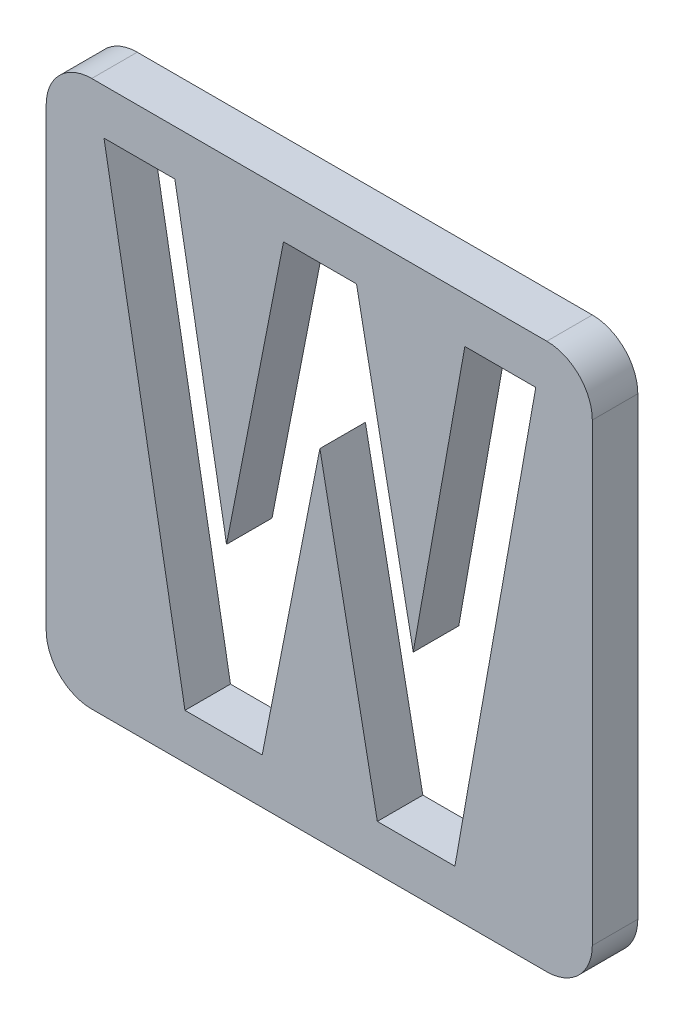
ISO-10303-21;
HEADER;
FILE_DESCRIPTION(('STEP AP214'),'2;1');
FILE_NAME('part.step','',(''),(''),'','','');
FILE_SCHEMA(('AUTOMOTIVE_DESIGN { 1 0 10303 214 1 1 1 1 }'));
ENDSEC;
DATA;
#1=APPLICATION_CONTEXT('core data for automotive mechanical design processes');
#2=APPLICATION_PROTOCOL_DEFINITION('international standard','automotive_design',2000,#1);
#3=PRODUCT_CONTEXT('',#1,'mechanical');
#4=PRODUCT('Part','Part','',(#3));
#5=PRODUCT_RELATED_PRODUCT_CATEGORY('part','',(#4));
#6=PRODUCT_DEFINITION_FORMATION('','',#4);
#7=PRODUCT_DEFINITION_CONTEXT('part definition',#1,'design');
#8=PRODUCT_DEFINITION('design','',#6,#7);
#9=PRODUCT_DEFINITION_SHAPE('','',#8);
#10=(LENGTH_UNIT() NAMED_UNIT(*) SI_UNIT(.MILLI.,.METRE.));
#11=(NAMED_UNIT(*) PLANE_ANGLE_UNIT() SI_UNIT($,.RADIAN.));
#12=(NAMED_UNIT(*) SI_UNIT($,.STERADIAN.) SOLID_ANGLE_UNIT());
#13=UNCERTAINTY_MEASURE_WITH_UNIT(LENGTH_MEASURE(1.E-05),#10,'distance_accuracy_value','');
#14=(GEOMETRIC_REPRESENTATION_CONTEXT(3) GLOBAL_UNCERTAINTY_ASSIGNED_CONTEXT((#13)) GLOBAL_UNIT_ASSIGNED_CONTEXT((#10,
#11,#12)) REPRESENTATION_CONTEXT('',''));
#15=CARTESIAN_POINT('',(0.,0.,0.));
#16=DIRECTION('',(0.,0.,1.));
#17=DIRECTION('',(1.,0.,0.));
#18=AXIS2_PLACEMENT_3D('',#15,#16,#17);
#19=CARTESIAN_POINT('',(50.,50.,10.));
#20=DIRECTION('',(0.,0.,-1.));
#21=DIRECTION('',(-1.,0.,0.));
#22=AXIS2_PLACEMENT_3D('',#19,#20,#21);
#23=PLANE('',#22);
#24=DIRECTION('',(1.,0.,0.));
#25=VECTOR('',#24,1.);
#26=CARTESIAN_POINT('',(-49.9999999999999,60.,10.));
#27=LINE('',#26,#25);
#28=CARTESIAN_POINT('',(-49.9999999999999,60.,10.));
#29=VERTEX_POINT('',#28);
#30=CARTESIAN_POINT('',(49.9999999999999,60.,10.));
#31=VERTEX_POINT('',#30);
#32=EDGE_CURVE('E278',#29,#31,#27,.T.);
#33=ORIENTED_EDGE('',*,*,#32,.F.);
#34=CARTESIAN_POINT('',(-50.,50.,10.));
#35=DIRECTION('',(0.,0.,1.));
#36=DIRECTION('',(1.,0.,0.));
#37=AXIS2_PLACEMENT_3D('',#34,#35,#36);
#38=CIRCLE('',#37,10.);
#39=CARTESIAN_POINT('',(-60.,49.9999999999999,10.));
#40=VERTEX_POINT('',#39);
#41=EDGE_CURVE('E296',#29,#40,#38,.T.);
#42=ORIENTED_EDGE('',*,*,#41,.T.);
#43=DIRECTION('',(0.,-1.,0.));
#44=VECTOR('',#43,1.);
#45=CARTESIAN_POINT('',(-60.,49.9999999999999,10.));
#46=LINE('',#45,#44);
#47=CARTESIAN_POINT('',(-60.,-49.9999999999999,10.));
#48=VERTEX_POINT('',#47);
#49=EDGE_CURVE('E294',#40,#48,#46,.T.);
#50=ORIENTED_EDGE('',*,*,#49,.T.);
#51=CARTESIAN_POINT('',(-50.,-50.,10.));
#52=DIRECTION('',(0.,0.,1.));
#53=DIRECTION('',(1.,0.,0.));
#54=AXIS2_PLACEMENT_3D('',#51,#52,#53);
#55=CIRCLE('',#54,10.);
#56=CARTESIAN_POINT('',(-49.9999999999999,-60.,10.));
#57=VERTEX_POINT('',#56);
#58=EDGE_CURVE('E292',#48,#57,#55,.T.);
#59=ORIENTED_EDGE('',*,*,#58,.T.);
#60=DIRECTION('',(1.,0.,0.));
#61=VECTOR('',#60,1.);
#62=CARTESIAN_POINT('',(-49.9999999999999,-60.,10.));
#63=LINE('',#62,#61);
#64=CARTESIAN_POINT('',(49.9999999999999,-60.,10.));
#65=VERTEX_POINT('',#64);
#66=EDGE_CURVE('E290',#57,#65,#63,.T.);
#67=ORIENTED_EDGE('',*,*,#66,.T.);
#68=CARTESIAN_POINT('',(50.,-50.,10.));
#69=DIRECTION('',(0.,0.,1.));
#70=DIRECTION('',(1.,0.,0.));
#71=AXIS2_PLACEMENT_3D('',#68,#69,#70);
#72=CIRCLE('',#71,10.);
#73=CARTESIAN_POINT('',(60.,-50.,10.));
#74=VERTEX_POINT('',#73);
#75=EDGE_CURVE('E288',#65,#74,#72,.T.);
#76=ORIENTED_EDGE('',*,*,#75,.T.);
#77=DIRECTION('',(0.,-1.,0.));
#78=VECTOR('',#77,1.);
#79=CARTESIAN_POINT('',(60.,49.9999999999999,10.));
#80=LINE('',#79,#78);
#81=CARTESIAN_POINT('',(60.,49.9999999999999,10.));
#82=VERTEX_POINT('',#81);
#83=EDGE_CURVE('E285',#82,#74,#80,.T.);
#84=ORIENTED_EDGE('',*,*,#83,.F.);
#85=CARTESIAN_POINT('',(50.,50.,10.));
#86=DIRECTION('',(0.,0.,-1.));
#87=DIRECTION('',(-1.,0.,0.));
#88=AXIS2_PLACEMENT_3D('',#85,#86,#87);
#89=CIRCLE('',#88,10.);
#90=EDGE_CURVE('E281',#31,#82,#89,.T.);
#91=ORIENTED_EDGE('',*,*,#90,.F.);
#92=EDGE_LOOP('',(#33,#42,#50,#59,#67,#76,#84,#91));
#93=FACE_BOUND('',#92,.T.);
#94=DIRECTION('',(-0.175135297584008,0.984544375607398,0.));
#95=VECTOR('',#94,1.);
#96=CARTESIAN_POINT('',(-29.5064102564103,-50.,10.));
#97=LINE('',#96,#95);
#98=CARTESIAN_POINT('',(-29.5064102564103,-50.,10.));
#99=VERTEX_POINT('',#98);
#100=CARTESIAN_POINT('',(-47.2948717948718,50.,10.));
#101=VERTEX_POINT('',#100);
#102=EDGE_CURVE('E50',#99,#101,#97,.T.);
#103=ORIENTED_EDGE('',*,*,#102,.T.);
#104=DIRECTION('',(1.,0.,0.));
#105=VECTOR('',#104,1.);
#106=CARTESIAN_POINT('',(-47.2948717948718,50.,10.));
#107=LINE('',#106,#105);
#108=CARTESIAN_POINT('',(-31.7299679487179,50.,10.));
#109=VERTEX_POINT('',#108);
#110=EDGE_CURVE('E192',#101,#109,#107,.T.);
#111=ORIENTED_EDGE('',*,*,#110,.T.);
#112=DIRECTION('',(0.175159771672657,-0.984540021729733,0.));
#113=VECTOR('',#112,1.);
#114=CARTESIAN_POINT('',(-31.7299679487179,50.,10.));
#115=LINE('',#114,#113);
#116=CARTESIAN_POINT('',(-20.3717948717949,-13.8421474358974,10.));
#117=VERTEX_POINT('',#116);
#118=EDGE_CURVE('E225',#109,#117,#115,.T.);
#119=ORIENTED_EDGE('',*,*,#118,.T.);
#120=DIRECTION('',(0.192443530225751,0.981308049327147,0.));
#121=VECTOR('',#120,1.);
#122=CARTESIAN_POINT('',(-20.3717948717949,-13.8421474358974,10.));
#123=LINE('',#122,#121);
#124=CARTESIAN_POINT('',(-7.85176282051282,50.,10.));
#125=VERTEX_POINT('',#124);
#126=EDGE_CURVE('E228',#117,#125,#123,.T.);
#127=ORIENTED_EDGE('',*,*,#126,.T.);
#128=DIRECTION('',(1.,0.,0.));
#129=VECTOR('',#128,1.);
#130=CARTESIAN_POINT('',(-7.85176282051282,50.,10.));
#131=LINE('',#130,#129);
#132=CARTESIAN_POINT('',(8.19391025641025,50.,10.));
#133=VERTEX_POINT('',#132);
#134=EDGE_CURVE('E231',#125,#133,#131,.T.);
#135=ORIENTED_EDGE('',*,*,#134,.T.);
#136=DIRECTION('',(0.191553774252207,-0.981482119842096,0.));
#137=VECTOR('',#136,1.);
#138=CARTESIAN_POINT('',(8.19391025641025,50.,10.));
#139=LINE('',#138,#137);
#140=CARTESIAN_POINT('',(20.6538461538461,-13.8421474358974,10.));
#141=VERTEX_POINT('',#140);
#142=EDGE_CURVE('E234',#133,#141,#139,.T.);
#143=ORIENTED_EDGE('',*,*,#142,.T.);
#144=DIRECTION('',(0.174860301693293,0.98459325352743,0.));
#145=VECTOR('',#144,1.);
#146=CARTESIAN_POINT('',(20.6538461538461,-13.8421474358974,10.));
#147=LINE('',#146,#145);
#148=CARTESIAN_POINT('',(31.9919871794872,50.,10.));
#149=VERTEX_POINT('',#148);
#150=EDGE_CURVE('E237',#141,#149,#147,.T.);
#151=ORIENTED_EDGE('',*,*,#150,.T.);
#152=DIRECTION('',(1.,0.,0.));
#153=VECTOR('',#152,1.);
#154=CARTESIAN_POINT('',(31.9919871794872,50.,10.));
#155=LINE('',#154,#153);
#156=CARTESIAN_POINT('',(47.5769230769231,50.,10.));
#157=VERTEX_POINT('',#156);
#158=EDGE_CURVE('E240',#149,#157,#155,.T.);
#159=ORIENTED_EDGE('',*,*,#158,.T.);
#160=DIRECTION('',(-0.174944112589188,-0.9845783653272,0.));
#161=VECTOR('',#160,1.);
#162=CARTESIAN_POINT('',(47.5769230769231,50.,10.));
#163=LINE('',#162,#161);
#164=CARTESIAN_POINT('',(29.8084935897436,-50.,10.));
#165=VERTEX_POINT('',#164);
#166=EDGE_CURVE('E243',#157,#165,#163,.T.);
#167=ORIENTED_EDGE('',*,*,#166,.T.);
#168=DIRECTION('',(-1.,0.,0.));
#169=VECTOR('',#168,1.);
#170=CARTESIAN_POINT('',(29.8084935897436,-50.,10.));
#171=LINE('',#170,#169);
#172=CARTESIAN_POINT('',(12.7612179487179,-50.,10.));
#173=VERTEX_POINT('',#172);
#174=EDGE_CURVE('E246',#165,#173,#171,.T.);
#175=ORIENTED_EDGE('',*,*,#174,.T.);
#176=DIRECTION('',(-0.191610403334479,0.981471065968833,0.));
#177=VECTOR('',#176,1.);
#178=CARTESIAN_POINT('',(12.7612179487179,-50.,10.));
#179=LINE('',#178,#177);
#180=CARTESIAN_POINT('',(0.141025641025638,14.6434294871795,10.));
#181=VERTEX_POINT('',#180);
#182=EDGE_CURVE('E249',#173,#181,#179,.T.);
#183=ORIENTED_EDGE('',*,*,#182,.T.);
#184=DIRECTION('',(-0.192489103559369,-0.981299110878488,0.));
#185=VECTOR('',#184,1.);
#186=CARTESIAN_POINT('',(0.141025641025638,14.6434294871795,10.));
#187=LINE('',#186,#185);
#188=CARTESIAN_POINT('',(-12.5392628205128,-50.,10.));
#189=VERTEX_POINT('',#188);
#190=EDGE_CURVE('E252',#181,#189,#187,.T.);
#191=ORIENTED_EDGE('',*,*,#190,.T.);
#192=DIRECTION('',(-1.,0.,0.));
#193=VECTOR('',#192,1.);
#194=CARTESIAN_POINT('',(-12.5392628205128,-50.,10.));
#195=LINE('',#194,#193);
#196=EDGE_CURVE('E186',#189,#99,#195,.T.);
#197=ORIENTED_EDGE('',*,*,#196,.T.);
#198=EDGE_LOOP('',(#103,#111,#119,#127,#135,#143,#151,#159,#167,#175,#183,#191,#197));
#199=FACE_BOUND('',#198,.T.);
#200=ADVANCED_FACE('F33',(#93,#199),#23,.F.);
#201=CARTESIAN_POINT('',(50.,50.,0.));
#202=DIRECTION('',(0.,0.,-1.));
#203=DIRECTION('',(-1.,0.,0.));
#204=AXIS2_PLACEMENT_3D('',#201,#202,#203);
#205=PLANE('',#204);
#206=DIRECTION('',(1.,0.,0.));
#207=VECTOR('',#206,1.);
#208=CARTESIAN_POINT('',(-49.9999999999999,60.,0.));
#209=LINE('',#208,#207);
#210=CARTESIAN_POINT('',(-49.9999999999999,60.,0.));
#211=VERTEX_POINT('',#210);
#212=CARTESIAN_POINT('',(49.9999999999999,60.,0.));
#213=VERTEX_POINT('',#212);
#214=EDGE_CURVE('E193',#211,#213,#209,.T.);
#215=ORIENTED_EDGE('',*,*,#214,.T.);
#216=CARTESIAN_POINT('',(50.,50.,0.));
#217=DIRECTION('',(0.,0.,-1.));
#218=DIRECTION('',(-1.,0.,0.));
#219=AXIS2_PLACEMENT_3D('',#216,#217,#218);
#220=CIRCLE('',#219,10.);
#221=CARTESIAN_POINT('',(60.,49.9999999999999,0.));
#222=VERTEX_POINT('',#221);
#223=EDGE_CURVE('E300',#213,#222,#220,.T.);
#224=ORIENTED_EDGE('',*,*,#223,.T.);
#225=DIRECTION('',(0.,-1.,0.));
#226=VECTOR('',#225,1.);
#227=CARTESIAN_POINT('',(60.,49.9999999999999,0.));
#228=LINE('',#227,#226);
#229=CARTESIAN_POINT('',(60.,-50.,0.));
#230=VERTEX_POINT('',#229);
#231=EDGE_CURVE('E303',#222,#230,#228,.T.);
#232=ORIENTED_EDGE('',*,*,#231,.T.);
#233=CARTESIAN_POINT('',(50.,-50.,0.));
#234=DIRECTION('',(0.,0.,1.));
#235=DIRECTION('',(1.,0.,0.));
#236=AXIS2_PLACEMENT_3D('',#233,#234,#235);
#237=CIRCLE('',#236,10.);
#238=CARTESIAN_POINT('',(49.9999999999999,-60.,0.));
#239=VERTEX_POINT('',#238);
#240=EDGE_CURVE('E306',#239,#230,#237,.T.);
#241=ORIENTED_EDGE('',*,*,#240,.F.);
#242=DIRECTION('',(1.,0.,0.));
#243=VECTOR('',#242,1.);
#244=CARTESIAN_POINT('',(-49.9999999999999,-60.,0.));
#245=LINE('',#244,#243);
#246=CARTESIAN_POINT('',(-49.9999999999999,-60.,0.));
#247=VERTEX_POINT('',#246);
#248=EDGE_CURVE('E309',#247,#239,#245,.T.);
#249=ORIENTED_EDGE('',*,*,#248,.F.);
#250=CARTESIAN_POINT('',(-50.,-50.,0.));
#251=DIRECTION('',(0.,0.,1.));
#252=DIRECTION('',(1.,0.,0.));
#253=AXIS2_PLACEMENT_3D('',#250,#251,#252);
#254=CIRCLE('',#253,10.);
#255=CARTESIAN_POINT('',(-60.,-49.9999999999999,0.));
#256=VERTEX_POINT('',#255);
#257=EDGE_CURVE('E311',#256,#247,#254,.T.);
#258=ORIENTED_EDGE('',*,*,#257,.F.);
#259=DIRECTION('',(0.,-1.,0.));
#260=VECTOR('',#259,1.);
#261=CARTESIAN_POINT('',(-60.,49.9999999999999,0.));
#262=LINE('',#261,#260);
#263=CARTESIAN_POINT('',(-60.,49.9999999999999,0.));
#264=VERTEX_POINT('',#263);
#265=EDGE_CURVE('E313',#264,#256,#262,.T.);
#266=ORIENTED_EDGE('',*,*,#265,.F.);
#267=CARTESIAN_POINT('',(-50.,50.,0.));
#268=DIRECTION('',(0.,0.,1.));
#269=DIRECTION('',(1.,0.,0.));
#270=AXIS2_PLACEMENT_3D('',#267,#268,#269);
#271=CIRCLE('',#270,10.);
#272=EDGE_CURVE('E282',#211,#264,#271,.T.);
#273=ORIENTED_EDGE('',*,*,#272,.F.);
#274=EDGE_LOOP('',(#215,#224,#232,#241,#249,#258,#266,#273));
#275=FACE_BOUND('',#274,.T.);
#276=DIRECTION('',(1.,0.,0.));
#277=VECTOR('',#276,1.);
#278=CARTESIAN_POINT('',(-47.2948717948718,50.,0.));
#279=LINE('',#278,#277);
#280=CARTESIAN_POINT('',(-47.2948717948718,50.,0.));
#281=VERTEX_POINT('',#280);
#282=CARTESIAN_POINT('',(-31.7299679487179,50.,0.));
#283=VERTEX_POINT('',#282);
#284=EDGE_CURVE('E185',#281,#283,#279,.T.);
#285=ORIENTED_EDGE('',*,*,#284,.F.);
#286=DIRECTION('',(-0.175135297584008,0.984544375607398,0.));
#287=VECTOR('',#286,1.);
#288=CARTESIAN_POINT('',(-29.5064102564103,-50.,0.));
#289=LINE('',#288,#287);
#290=CARTESIAN_POINT('',(-29.5064102564103,-50.,0.));
#291=VERTEX_POINT('',#290);
#292=EDGE_CURVE('E177',#291,#281,#289,.T.);
#293=ORIENTED_EDGE('',*,*,#292,.F.);
#294=DIRECTION('',(-1.,0.,0.));
#295=VECTOR('',#294,1.);
#296=CARTESIAN_POINT('',(-12.5392628205128,-50.,0.));
#297=LINE('',#296,#295);
#298=CARTESIAN_POINT('',(-12.5392628205128,-50.,0.));
#299=VERTEX_POINT('',#298);
#300=EDGE_CURVE('E221',#299,#291,#297,.T.);
#301=ORIENTED_EDGE('',*,*,#300,.F.);
#302=DIRECTION('',(-0.192489103559369,-0.981299110878488,0.));
#303=VECTOR('',#302,1.);
#304=CARTESIAN_POINT('',(0.141025641025638,14.6434294871795,0.));
#305=LINE('',#304,#303);
#306=CARTESIAN_POINT('',(0.141025641025638,14.6434294871795,0.));
#307=VERTEX_POINT('',#306);
#308=EDGE_CURVE('E219',#307,#299,#305,.T.);
#309=ORIENTED_EDGE('',*,*,#308,.F.);
#310=DIRECTION('',(-0.191610403334479,0.981471065968833,0.));
#311=VECTOR('',#310,1.);
#312=CARTESIAN_POINT('',(12.7612179487179,-50.,0.));
#313=LINE('',#312,#311);
#314=CARTESIAN_POINT('',(12.7612179487179,-50.,0.));
#315=VERTEX_POINT('',#314);
#316=EDGE_CURVE('E217',#315,#307,#313,.T.);
#317=ORIENTED_EDGE('',*,*,#316,.F.);
#318=DIRECTION('',(-1.,0.,0.));
#319=VECTOR('',#318,1.);
#320=CARTESIAN_POINT('',(29.8084935897436,-50.,0.));
#321=LINE('',#320,#319);
#322=CARTESIAN_POINT('',(29.8084935897436,-50.,0.));
#323=VERTEX_POINT('',#322);
#324=EDGE_CURVE('E215',#323,#315,#321,.T.);
#325=ORIENTED_EDGE('',*,*,#324,.F.);
#326=DIRECTION('',(-0.174944112589188,-0.9845783653272,0.));
#327=VECTOR('',#326,1.);
#328=CARTESIAN_POINT('',(47.5769230769231,50.,0.));
#329=LINE('',#328,#327);
#330=CARTESIAN_POINT('',(47.5769230769231,50.,0.));
#331=VERTEX_POINT('',#330);
#332=EDGE_CURVE('E213',#331,#323,#329,.T.);
#333=ORIENTED_EDGE('',*,*,#332,.F.);
#334=DIRECTION('',(1.,0.,0.));
#335=VECTOR('',#334,1.);
#336=CARTESIAN_POINT('',(31.9919871794872,50.,0.));
#337=LINE('',#336,#335);
#338=CARTESIAN_POINT('',(31.9919871794872,50.,0.));
#339=VERTEX_POINT('',#338);
#340=EDGE_CURVE('E211',#339,#331,#337,.T.);
#341=ORIENTED_EDGE('',*,*,#340,.F.);
#342=DIRECTION('',(0.174860301693293,0.98459325352743,0.));
#343=VECTOR('',#342,1.);
#344=CARTESIAN_POINT('',(20.6538461538461,-13.8421474358974,0.));
#345=LINE('',#344,#343);
#346=CARTESIAN_POINT('',(20.6538461538461,-13.8421474358974,0.));
#347=VERTEX_POINT('',#346);
#348=EDGE_CURVE('E209',#347,#339,#345,.T.);
#349=ORIENTED_EDGE('',*,*,#348,.F.);
#350=DIRECTION('',(0.191553774252207,-0.981482119842096,0.));
#351=VECTOR('',#350,1.);
#352=CARTESIAN_POINT('',(8.19391025641025,50.,0.));
#353=LINE('',#352,#351);
#354=CARTESIAN_POINT('',(8.19391025641025,50.,0.));
#355=VERTEX_POINT('',#354);
#356=EDGE_CURVE('E207',#355,#347,#353,.T.);
#357=ORIENTED_EDGE('',*,*,#356,.F.);
#358=DIRECTION('',(1.,0.,0.));
#359=VECTOR('',#358,1.);
#360=CARTESIAN_POINT('',(-7.85176282051282,50.,0.));
#361=LINE('',#360,#359);
#362=CARTESIAN_POINT('',(-7.85176282051282,50.,0.));
#363=VERTEX_POINT('',#362);
#364=EDGE_CURVE('E205',#363,#355,#361,.T.);
#365=ORIENTED_EDGE('',*,*,#364,.F.);
#366=DIRECTION('',(0.192443530225751,0.981308049327147,0.));
#367=VECTOR('',#366,1.);
#368=CARTESIAN_POINT('',(-20.3717948717949,-13.8421474358974,0.));
#369=LINE('',#368,#367);
#370=CARTESIAN_POINT('',(-20.3717948717949,-13.8421474358974,0.));
#371=VERTEX_POINT('',#370);
#372=EDGE_CURVE('E201',#371,#363,#369,.T.);
#373=ORIENTED_EDGE('',*,*,#372,.F.);
#374=DIRECTION('',(0.175159771672657,-0.984540021729733,0.));
#375=VECTOR('',#374,1.);
#376=CARTESIAN_POINT('',(-31.7299679487179,50.,0.));
#377=LINE('',#376,#375);
#378=EDGE_CURVE('E199',#283,#371,#377,.T.);
#379=ORIENTED_EDGE('',*,*,#378,.F.);
#380=EDGE_LOOP('',(#285,#293,#301,#309,#317,#325,#333,#341,#349,#357,#365,#373,#379));
#381=FACE_BOUND('',#380,.T.);
#382=ADVANCED_FACE('F197',(#275,#381),#205,.T.);
#383=CARTESIAN_POINT('',(-49.9999999999999,60.,10.));
#384=DIRECTION('',(0.,1.,0.));
#385=DIRECTION('',(0.,0.,1.));
#386=AXIS2_PLACEMENT_3D('',#383,#384,#385);
#387=PLANE('',#386);
#388=ORIENTED_EDGE('',*,*,#214,.F.);
#389=DIRECTION('',(0.,0.,-1.));
#390=VECTOR('',#389,1.);
#391=CARTESIAN_POINT('',(-49.9999999999999,60.,10.));
#392=LINE('',#391,#390);
#393=EDGE_CURVE('E11',#29,#211,#392,.T.);
#394=ORIENTED_EDGE('',*,*,#393,.F.);
#395=ORIENTED_EDGE('',*,*,#32,.T.);
#396=DIRECTION('',(0.,0.,-1.));
#397=VECTOR('',#396,1.);
#398=CARTESIAN_POINT('',(49.9999999999999,60.,10.));
#399=LINE('',#398,#397);
#400=EDGE_CURVE('E37',#31,#213,#399,.T.);
#401=ORIENTED_EDGE('',*,*,#400,.T.);
#402=EDGE_LOOP('',(#388,#394,#395,#401));
#403=FACE_BOUND('',#402,.T.);
#404=ADVANCED_FACE('F35',(#403),#387,.T.);
#405=CARTESIAN_POINT('',(-50.,50.,10.));
#406=DIRECTION('',(0.,0.,-1.));
#407=DIRECTION('',(-1.,0.,0.));
#408=AXIS2_PLACEMENT_3D('',#405,#406,#407);
#409=CYLINDRICAL_SURFACE('',#408,10.);
#410=ORIENTED_EDGE('',*,*,#272,.T.);
#411=DIRECTION('',(0.,0.,-1.));
#412=VECTOR('',#411,1.);
#413=CARTESIAN_POINT('',(-60.,49.9999999999999,10.));
#414=LINE('',#413,#412);
#415=EDGE_CURVE('E42',#40,#264,#414,.T.);
#416=ORIENTED_EDGE('',*,*,#415,.F.);
#417=ORIENTED_EDGE('',*,*,#41,.F.);
#418=ORIENTED_EDGE('',*,*,#393,.T.);
#419=EDGE_LOOP('',(#410,#416,#417,#418));
#420=FACE_BOUND('',#419,.T.);
#421=ADVANCED_FACE('F343',(#420),#409,.T.);
#422=CARTESIAN_POINT('',(-60.,49.9999999999999,10.));
#423=DIRECTION('',(1.,0.,0.));
#424=DIRECTION('',(0.,1.,0.));
#425=AXIS2_PLACEMENT_3D('',#422,#423,#424);
#426=PLANE('',#425);
#427=ORIENTED_EDGE('',*,*,#265,.T.);
#428=DIRECTION('',(0.,0.,-1.));
#429=VECTOR('',#428,1.);
#430=CARTESIAN_POINT('',(-60.,-49.9999999999999,10.));
#431=LINE('',#430,#429);
#432=EDGE_CURVE('E318',#48,#256,#431,.T.);
#433=ORIENTED_EDGE('',*,*,#432,.F.);
#434=ORIENTED_EDGE('',*,*,#49,.F.);
#435=ORIENTED_EDGE('',*,*,#415,.T.);
#436=EDGE_LOOP('',(#427,#433,#434,#435));
#437=FACE_BOUND('',#436,.T.);
#438=ADVANCED_FACE('F347',(#437),#426,.F.);
#439=CARTESIAN_POINT('',(-50.,-50.,10.));
#440=DIRECTION('',(0.,0.,-1.));
#441=DIRECTION('',(-1.,0.,0.));
#442=AXIS2_PLACEMENT_3D('',#439,#440,#441);
#443=CYLINDRICAL_SURFACE('',#442,10.);
#444=ORIENTED_EDGE('',*,*,#257,.T.);
#445=DIRECTION('',(0.,0.,-1.));
#446=VECTOR('',#445,1.);
#447=CARTESIAN_POINT('',(-49.9999999999999,-60.,10.));
#448=LINE('',#447,#446);
#449=EDGE_CURVE('E321',#57,#247,#448,.T.);
#450=ORIENTED_EDGE('',*,*,#449,.F.);
#451=ORIENTED_EDGE('',*,*,#58,.F.);
#452=ORIENTED_EDGE('',*,*,#432,.T.);
#453=EDGE_LOOP('',(#444,#450,#451,#452));
#454=FACE_BOUND('',#453,.T.);
#455=ADVANCED_FACE('F367',(#454),#443,.T.);
#456=CARTESIAN_POINT('',(-49.9999999999999,-60.,10.));
#457=DIRECTION('',(0.,1.,0.));
#458=DIRECTION('',(0.,0.,1.));
#459=AXIS2_PLACEMENT_3D('',#456,#457,#458);
#460=PLANE('',#459);
#461=ORIENTED_EDGE('',*,*,#248,.T.);
#462=DIRECTION('',(0.,0.,-1.));
#463=VECTOR('',#462,1.);
#464=CARTESIAN_POINT('',(49.9999999999999,-60.,10.));
#465=LINE('',#464,#463);
#466=EDGE_CURVE('E324',#65,#239,#465,.T.);
#467=ORIENTED_EDGE('',*,*,#466,.F.);
#468=ORIENTED_EDGE('',*,*,#66,.F.);
#469=ORIENTED_EDGE('',*,*,#449,.T.);
#470=EDGE_LOOP('',(#461,#467,#468,#469));
#471=FACE_BOUND('',#470,.T.);
#472=ADVANCED_FACE('F365',(#471),#460,.F.);
#473=CARTESIAN_POINT('',(50.,-50.,10.));
#474=DIRECTION('',(0.,0.,-1.));
#475=DIRECTION('',(-1.,0.,0.));
#476=AXIS2_PLACEMENT_3D('',#473,#474,#475);
#477=CYLINDRICAL_SURFACE('',#476,10.);
#478=ORIENTED_EDGE('',*,*,#240,.T.);
#479=DIRECTION('',(0.,0.,-1.));
#480=VECTOR('',#479,1.);
#481=CARTESIAN_POINT('',(60.,-50.,10.));
#482=LINE('',#481,#480);
#483=EDGE_CURVE('E327',#74,#230,#482,.T.);
#484=ORIENTED_EDGE('',*,*,#483,.F.);
#485=ORIENTED_EDGE('',*,*,#75,.F.);
#486=ORIENTED_EDGE('',*,*,#466,.T.);
#487=EDGE_LOOP('',(#478,#484,#485,#486));
#488=FACE_BOUND('',#487,.T.);
#489=ADVANCED_FACE('F361',(#488),#477,.T.);
#490=CARTESIAN_POINT('',(60.,49.9999999999999,10.));
#491=DIRECTION('',(1.,0.,0.));
#492=DIRECTION('',(0.,1.,0.));
#493=AXIS2_PLACEMENT_3D('',#490,#491,#492);
#494=PLANE('',#493);
#495=ORIENTED_EDGE('',*,*,#231,.F.);
#496=DIRECTION('',(0.,0.,-1.));
#497=VECTOR('',#496,1.);
#498=CARTESIAN_POINT('',(60.,49.9999999999999,10.));
#499=LINE('',#498,#497);
#500=EDGE_CURVE('E328',#82,#222,#499,.T.);
#501=ORIENTED_EDGE('',*,*,#500,.F.);
#502=ORIENTED_EDGE('',*,*,#83,.T.);
#503=ORIENTED_EDGE('',*,*,#483,.T.);
#504=EDGE_LOOP('',(#495,#501,#502,#503));
#505=FACE_BOUND('',#504,.T.);
#506=ADVANCED_FACE('F357',(#505),#494,.T.);
#507=CARTESIAN_POINT('',(50.,50.,10.));
#508=DIRECTION('',(0.,0.,-1.));
#509=DIRECTION('',(-1.,0.,0.));
#510=AXIS2_PLACEMENT_3D('',#507,#508,#509);
#511=CYLINDRICAL_SURFACE('',#510,10.);
#512=ORIENTED_EDGE('',*,*,#223,.F.);
#513=ORIENTED_EDGE('',*,*,#400,.F.);
#514=ORIENTED_EDGE('',*,*,#90,.T.);
#515=ORIENTED_EDGE('',*,*,#500,.T.);
#516=EDGE_LOOP('',(#512,#513,#514,#515));
#517=FACE_BOUND('',#516,.T.);
#518=ADVANCED_FACE('F336',(#517),#511,.T.);
#519=CARTESIAN_POINT('',(-29.5064102564103,-50.,0.));
#520=DIRECTION('',(0.984544375607398,0.175135297584008,0.));
#521=DIRECTION('',(-0.175135297584008,0.984544375607398,0.));
#522=AXIS2_PLACEMENT_3D('',#519,#520,#521);
#523=PLANE('',#522);
#524=ORIENTED_EDGE('',*,*,#102,.F.);
#525=DIRECTION('',(0.,0.,1.));
#526=VECTOR('',#525,1.);
#527=CARTESIAN_POINT('',(-29.5064102564103,-50.,0.));
#528=LINE('',#527,#526);
#529=EDGE_CURVE('E181',#291,#99,#528,.T.);
#530=ORIENTED_EDGE('',*,*,#529,.F.);
#531=ORIENTED_EDGE('',*,*,#292,.T.);
#532=DIRECTION('',(0.,0.,1.));
#533=VECTOR('',#532,1.);
#534=CARTESIAN_POINT('',(-47.2948717948718,50.,0.));
#535=LINE('',#534,#533);
#536=EDGE_CURVE('E180',#281,#101,#535,.T.);
#537=ORIENTED_EDGE('',*,*,#536,.T.);
#538=EDGE_LOOP('',(#524,#530,#531,#537));
#539=FACE_BOUND('',#538,.T.);
#540=ADVANCED_FACE('F179',(#539),#523,.T.);
#541=CARTESIAN_POINT('',(-47.2948717948718,50.,0.));
#542=DIRECTION('',(0.,-1.,0.));
#543=DIRECTION('',(0.,0.,-1.));
#544=AXIS2_PLACEMENT_3D('',#541,#542,#543);
#545=PLANE('',#544);
#546=ORIENTED_EDGE('',*,*,#110,.F.);
#547=ORIENTED_EDGE('',*,*,#536,.F.);
#548=ORIENTED_EDGE('',*,*,#284,.T.);
#549=DIRECTION('',(0.,0.,1.));
#550=VECTOR('',#549,1.);
#551=CARTESIAN_POINT('',(-31.7299679487179,50.,0.));
#552=LINE('',#551,#550);
#553=EDGE_CURVE('E194',#283,#109,#552,.T.);
#554=ORIENTED_EDGE('',*,*,#553,.T.);
#555=EDGE_LOOP('',(#546,#547,#548,#554));
#556=FACE_BOUND('',#555,.T.);
#557=ADVANCED_FACE('F189',(#556),#545,.T.);
#558=CARTESIAN_POINT('',(-31.7299679487179,50.,0.));
#559=DIRECTION('',(-0.984540021729733,-0.175159771672657,0.));
#560=DIRECTION('',(0.175159771672657,-0.984540021729733,0.));
#561=AXIS2_PLACEMENT_3D('',#558,#559,#560);
#562=PLANE('',#561);
#563=ORIENTED_EDGE('',*,*,#118,.F.);
#564=ORIENTED_EDGE('',*,*,#553,.F.);
#565=ORIENTED_EDGE('',*,*,#378,.T.);
#566=DIRECTION('',(0.,0.,1.));
#567=VECTOR('',#566,1.);
#568=CARTESIAN_POINT('',(-20.3717948717949,-13.8421474358974,0.));
#569=LINE('',#568,#567);
#570=EDGE_CURVE('E275',#371,#117,#569,.T.);
#571=ORIENTED_EDGE('',*,*,#570,.T.);
#572=EDGE_LOOP('',(#563,#564,#565,#571));
#573=FACE_BOUND('',#572,.T.);
#574=ADVANCED_FACE('F416',(#573),#562,.T.);
#575=CARTESIAN_POINT('',(-20.3717948717949,-13.8421474358974,0.));
#576=DIRECTION('',(0.981308049327147,-0.192443530225751,0.));
#577=DIRECTION('',(0.192443530225751,0.981308049327147,0.));
#578=AXIS2_PLACEMENT_3D('',#575,#576,#577);
#579=PLANE('',#578);
#580=ORIENTED_EDGE('',*,*,#126,.F.);
#581=ORIENTED_EDGE('',*,*,#570,.F.);
#582=ORIENTED_EDGE('',*,*,#372,.T.);
#583=DIRECTION('',(0.,0.,1.));
#584=VECTOR('',#583,1.);
#585=CARTESIAN_POINT('',(-7.85176282051282,50.,0.));
#586=LINE('',#585,#584);
#587=EDGE_CURVE('E273',#363,#125,#586,.T.);
#588=ORIENTED_EDGE('',*,*,#587,.T.);
#589=EDGE_LOOP('',(#580,#581,#582,#588));
#590=FACE_BOUND('',#589,.T.);
#591=ADVANCED_FACE('F424',(#590),#579,.T.);
#592=CARTESIAN_POINT('',(-7.85176282051282,50.,0.));
#593=DIRECTION('',(0.,-1.,0.));
#594=DIRECTION('',(0.,0.,-1.));
#595=AXIS2_PLACEMENT_3D('',#592,#593,#594);
#596=PLANE('',#595);
#597=ORIENTED_EDGE('',*,*,#134,.F.);
#598=ORIENTED_EDGE('',*,*,#587,.F.);
#599=ORIENTED_EDGE('',*,*,#364,.T.);
#600=DIRECTION('',(0.,0.,1.));
#601=VECTOR('',#600,1.);
#602=CARTESIAN_POINT('',(8.19391025641025,50.,0.));
#603=LINE('',#602,#601);
#604=EDGE_CURVE('E271',#355,#133,#603,.T.);
#605=ORIENTED_EDGE('',*,*,#604,.T.);
#606=EDGE_LOOP('',(#597,#598,#599,#605));
#607=FACE_BOUND('',#606,.T.);
#608=ADVANCED_FACE('F434',(#607),#596,.T.);
#609=CARTESIAN_POINT('',(8.19391025641025,50.,0.));
#610=DIRECTION('',(-0.981482119842096,-0.191553774252207,0.));
#611=DIRECTION('',(0.191553774252207,-0.981482119842096,0.));
#612=AXIS2_PLACEMENT_3D('',#609,#610,#611);
#613=PLANE('',#612);
#614=ORIENTED_EDGE('',*,*,#142,.F.);
#615=ORIENTED_EDGE('',*,*,#604,.F.);
#616=ORIENTED_EDGE('',*,*,#356,.T.);
#617=DIRECTION('',(0.,0.,1.));
#618=VECTOR('',#617,1.);
#619=CARTESIAN_POINT('',(20.6538461538461,-13.8421474358974,0.));
#620=LINE('',#619,#618);
#621=EDGE_CURVE('E269',#347,#141,#620,.T.);
#622=ORIENTED_EDGE('',*,*,#621,.T.);
#623=EDGE_LOOP('',(#614,#615,#616,#622));
#624=FACE_BOUND('',#623,.T.);
#625=ADVANCED_FACE('F444',(#624),#613,.T.);
#626=CARTESIAN_POINT('',(20.6538461538461,-13.8421474358974,0.));
#627=DIRECTION('',(0.98459325352743,-0.174860301693293,0.));
#628=DIRECTION('',(0.174860301693293,0.98459325352743,0.));
#629=AXIS2_PLACEMENT_3D('',#626,#627,#628);
#630=PLANE('',#629);
#631=ORIENTED_EDGE('',*,*,#150,.F.);
#632=ORIENTED_EDGE('',*,*,#621,.F.);
#633=ORIENTED_EDGE('',*,*,#348,.T.);
#634=DIRECTION('',(0.,0.,1.));
#635=VECTOR('',#634,1.);
#636=CARTESIAN_POINT('',(31.9919871794872,50.,0.));
#637=LINE('',#636,#635);
#638=EDGE_CURVE('E267',#339,#149,#637,.T.);
#639=ORIENTED_EDGE('',*,*,#638,.T.);
#640=EDGE_LOOP('',(#631,#632,#633,#639));
#641=FACE_BOUND('',#640,.T.);
#642=ADVANCED_FACE('F454',(#641),#630,.T.);
#643=CARTESIAN_POINT('',(31.9919871794872,50.,0.));
#644=DIRECTION('',(0.,-1.,0.));
#645=DIRECTION('',(0.,0.,-1.));
#646=AXIS2_PLACEMENT_3D('',#643,#644,#645);
#647=PLANE('',#646);
#648=ORIENTED_EDGE('',*,*,#158,.F.);
#649=ORIENTED_EDGE('',*,*,#638,.F.);
#650=ORIENTED_EDGE('',*,*,#340,.T.);
#651=DIRECTION('',(0.,0.,1.));
#652=VECTOR('',#651,1.);
#653=CARTESIAN_POINT('',(47.5769230769231,50.,0.));
#654=LINE('',#653,#652);
#655=EDGE_CURVE('E265',#331,#157,#654,.T.);
#656=ORIENTED_EDGE('',*,*,#655,.T.);
#657=EDGE_LOOP('',(#648,#649,#650,#656));
#658=FACE_BOUND('',#657,.T.);
#659=ADVANCED_FACE('F464',(#658),#647,.T.);
#660=CARTESIAN_POINT('',(47.5769230769231,50.,0.));
#661=DIRECTION('',(-0.9845783653272,0.174944112589188,0.));
#662=DIRECTION('',(-0.174944112589188,-0.9845783653272,0.));
#663=AXIS2_PLACEMENT_3D('',#660,#661,#662);
#664=PLANE('',#663);
#665=ORIENTED_EDGE('',*,*,#166,.F.);
#666=ORIENTED_EDGE('',*,*,#655,.F.);
#667=ORIENTED_EDGE('',*,*,#332,.T.);
#668=DIRECTION('',(0.,0.,1.));
#669=VECTOR('',#668,1.);
#670=CARTESIAN_POINT('',(29.8084935897436,-50.,0.));
#671=LINE('',#670,#669);
#672=EDGE_CURVE('E263',#323,#165,#671,.T.);
#673=ORIENTED_EDGE('',*,*,#672,.T.);
#674=EDGE_LOOP('',(#665,#666,#667,#673));
#675=FACE_BOUND('',#674,.T.);
#676=ADVANCED_FACE('F474',(#675),#664,.T.);
#677=CARTESIAN_POINT('',(29.8084935897436,-50.,0.));
#678=DIRECTION('',(0.,1.,0.));
#679=DIRECTION('',(0.,0.,1.));
#680=AXIS2_PLACEMENT_3D('',#677,#678,#679);
#681=PLANE('',#680);
#682=ORIENTED_EDGE('',*,*,#174,.F.);
#683=ORIENTED_EDGE('',*,*,#672,.F.);
#684=ORIENTED_EDGE('',*,*,#324,.T.);
#685=DIRECTION('',(0.,0.,1.));
#686=VECTOR('',#685,1.);
#687=CARTESIAN_POINT('',(12.7612179487179,-50.,0.));
#688=LINE('',#687,#686);
#689=EDGE_CURVE('E261',#315,#173,#688,.T.);
#690=ORIENTED_EDGE('',*,*,#689,.T.);
#691=EDGE_LOOP('',(#682,#683,#684,#690));
#692=FACE_BOUND('',#691,.T.);
#693=ADVANCED_FACE('F484',(#692),#681,.T.);
#694=CARTESIAN_POINT('',(12.7612179487179,-50.,0.));
#695=DIRECTION('',(0.981471065968833,0.191610403334479,0.));
#696=DIRECTION('',(-0.191610403334479,0.981471065968834,0.));
#697=AXIS2_PLACEMENT_3D('',#694,#695,#696);
#698=PLANE('',#697);
#699=ORIENTED_EDGE('',*,*,#182,.F.);
#700=ORIENTED_EDGE('',*,*,#689,.F.);
#701=ORIENTED_EDGE('',*,*,#316,.T.);
#702=DIRECTION('',(0.,0.,1.));
#703=VECTOR('',#702,1.);
#704=CARTESIAN_POINT('',(0.141025641025638,14.6434294871795,0.));
#705=LINE('',#704,#703);
#706=EDGE_CURVE('E259',#307,#181,#705,.T.);
#707=ORIENTED_EDGE('',*,*,#706,.T.);
#708=EDGE_LOOP('',(#699,#700,#701,#707));
#709=FACE_BOUND('',#708,.T.);
#710=ADVANCED_FACE('F494',(#709),#698,.T.);
#711=CARTESIAN_POINT('',(0.141025641025638,14.6434294871795,0.));
#712=DIRECTION('',(-0.981299110878488,0.192489103559369,0.));
#713=DIRECTION('',(-0.192489103559369,-0.981299110878488,0.));
#714=AXIS2_PLACEMENT_3D('',#711,#712,#713);
#715=PLANE('',#714);
#716=ORIENTED_EDGE('',*,*,#190,.F.);
#717=ORIENTED_EDGE('',*,*,#706,.F.);
#718=ORIENTED_EDGE('',*,*,#308,.T.);
#719=DIRECTION('',(0.,0.,1.));
#720=VECTOR('',#719,1.);
#721=CARTESIAN_POINT('',(-12.5392628205128,-50.,0.));
#722=LINE('',#721,#720);
#723=EDGE_CURVE('E58',#299,#189,#722,.T.);
#724=ORIENTED_EDGE('',*,*,#723,.T.);
#725=EDGE_LOOP('',(#716,#717,#718,#724));
#726=FACE_BOUND('',#725,.T.);
#727=ADVANCED_FACE('F504',(#726),#715,.T.);
#728=CARTESIAN_POINT('',(-12.5392628205128,-50.,0.));
#729=DIRECTION('',(0.,1.,0.));
#730=DIRECTION('',(0.,0.,1.));
#731=AXIS2_PLACEMENT_3D('',#728,#729,#730);
#732=PLANE('',#731);
#733=ORIENTED_EDGE('',*,*,#196,.F.);
#734=ORIENTED_EDGE('',*,*,#723,.F.);
#735=ORIENTED_EDGE('',*,*,#300,.T.);
#736=ORIENTED_EDGE('',*,*,#529,.T.);
#737=EDGE_LOOP('',(#733,#734,#735,#736));
#738=FACE_BOUND('',#737,.T.);
#739=ADVANCED_FACE('F514',(#738),#732,.T.);
#740=CLOSED_SHELL('',(#200,#382,#404,#421,#438,#455,#472,#489,#506,#518,#540,#557,#574,#591,
#608,#625,#642,#659,#676,#693,#710,#727,#739));
#741=MANIFOLD_SOLID_BREP('B2',#740);
#742=ADVANCED_BREP_SHAPE_REPRESENTATION('',(#18,#741),#14);
#743=SHAPE_DEFINITION_REPRESENTATION(#9,#742);
ENDSEC;
END-ISO-10303-21;
